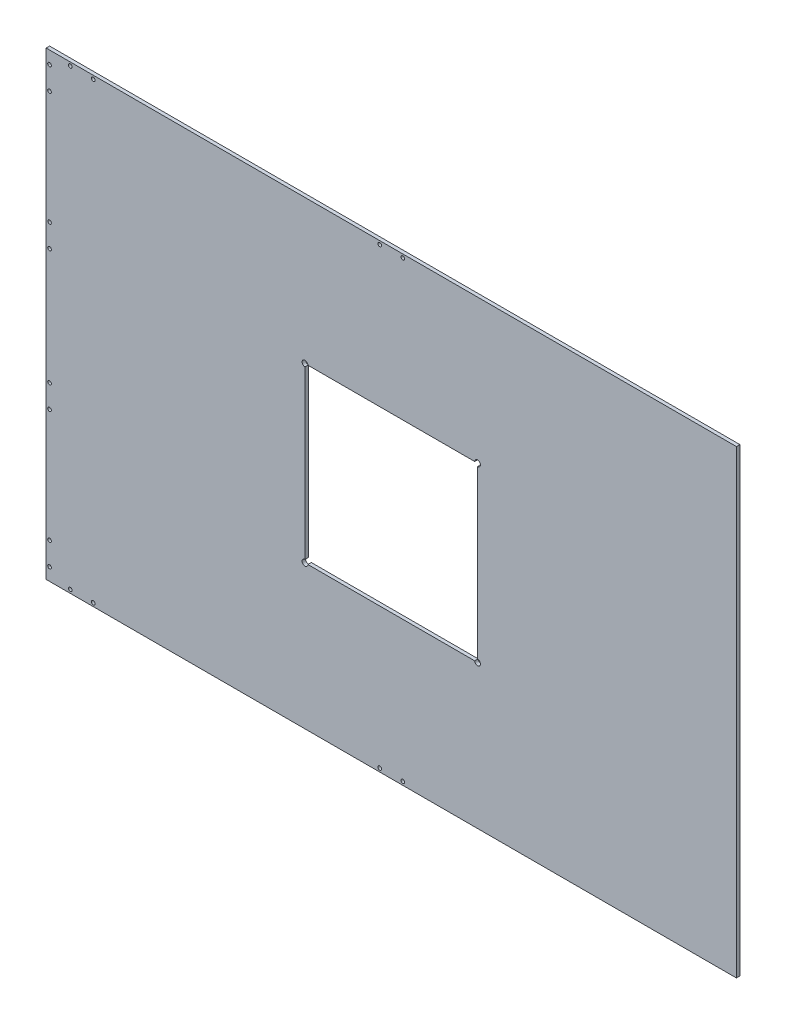
ISO-10303-21;
HEADER;
FILE_DESCRIPTION(('STEP AP214'),'2;1');
FILE_NAME('part.step','',(''),(''),'','','');
FILE_SCHEMA(('AUTOMOTIVE_DESIGN { 1 0 10303 214 1 1 1 1 }'));
ENDSEC;
DATA;
#1=APPLICATION_CONTEXT('core data for automotive mechanical design processes');
#2=APPLICATION_PROTOCOL_DEFINITION('international standard','automotive_design',2000,#1);
#3=PRODUCT_CONTEXT('',#1,'mechanical');
#4=PRODUCT('Part','Part','',(#3));
#5=PRODUCT_RELATED_PRODUCT_CATEGORY('part','',(#4));
#6=PRODUCT_DEFINITION_FORMATION('','',#4);
#7=PRODUCT_DEFINITION_CONTEXT('part definition',#1,'design');
#8=PRODUCT_DEFINITION('design','',#6,#7);
#9=PRODUCT_DEFINITION_SHAPE('','',#8);
#10=(LENGTH_UNIT() NAMED_UNIT(*) SI_UNIT(.MILLI.,.METRE.));
#11=(NAMED_UNIT(*) PLANE_ANGLE_UNIT() SI_UNIT($,.RADIAN.));
#12=(NAMED_UNIT(*) SI_UNIT($,.STERADIAN.) SOLID_ANGLE_UNIT());
#13=UNCERTAINTY_MEASURE_WITH_UNIT(LENGTH_MEASURE(1.E-05),#10,'distance_accuracy_value','');
#14=(GEOMETRIC_REPRESENTATION_CONTEXT(3) GLOBAL_UNCERTAINTY_ASSIGNED_CONTEXT((#13)) GLOBAL_UNIT_ASSIGNED_CONTEXT((#10,
#11,#12)) REPRESENTATION_CONTEXT('',''));
#15=CARTESIAN_POINT('',(0.,0.,0.));
#16=DIRECTION('',(0.,0.,1.));
#17=DIRECTION('',(1.,0.,0.));
#18=AXIS2_PLACEMENT_3D('',#15,#16,#17);
#19=CARTESIAN_POINT('',(0.,0.,3.));
#20=DIRECTION('',(0.,0.,1.));
#21=DIRECTION('',(1.,0.,0.));
#22=AXIS2_PLACEMENT_3D('',#19,#20,#21);
#23=PLANE('',#22);
#24=CARTESIAN_POINT('',(-297.,70.4999999999999,3.));
#25=DIRECTION('',(0.,0.,-1.));
#26=DIRECTION('',(1.,0.,0.));
#27=AXIS2_PLACEMENT_3D('',#24,#25,#26);
#28=CIRCLE('',#27,1.575);
#29=CARTESIAN_POINT('',(-295.425,70.4999999999999,3.));
#30=VERTEX_POINT('',#29);
#31=EDGE_CURVE('E288',#30,#30,#28,.T.);
#32=ORIENTED_EDGE('',*,*,#31,.T.);
#33=EDGE_LOOP('',(#32));
#34=FACE_BOUND('',#33,.T.);
#35=CARTESIAN_POINT('',(-297.,-50.4999999999999,3.));
#36=DIRECTION('',(0.,0.,-1.));
#37=DIRECTION('',(-1.,0.,0.));
#38=AXIS2_PLACEMENT_3D('',#35,#36,#37);
#39=CIRCLE('',#38,1.57500000000001);
#40=CARTESIAN_POINT('',(-298.575,-50.4999999999999,3.));
#41=VERTEX_POINT('',#40);
#42=EDGE_CURVE('E612',#41,#41,#39,.T.);
#43=ORIENTED_EDGE('',*,*,#42,.T.);
#44=EDGE_LOOP('',(#43));
#45=FACE_BOUND('',#44,.T.);
#46=CARTESIAN_POINT('',(-297.,-70.4999999999999,3.));
#47=DIRECTION('',(0.,0.,-1.));
#48=DIRECTION('',(-1.,0.,0.));
#49=AXIS2_PLACEMENT_3D('',#46,#47,#48);
#50=CIRCLE('',#49,1.575);
#51=CARTESIAN_POINT('',(-298.575,-70.4999999999999,3.));
#52=VERTEX_POINT('',#51);
#53=EDGE_CURVE('E625',#52,#52,#50,.T.);
#54=ORIENTED_EDGE('',*,*,#53,.T.);
#55=EDGE_LOOP('',(#54));
#56=FACE_BOUND('',#55,.T.);
#57=CARTESIAN_POINT('',(-297.,50.4999999999999,3.));
#58=DIRECTION('',(0.,0.,-1.));
#59=DIRECTION('',(1.,0.,0.));
#60=AXIS2_PLACEMENT_3D('',#57,#58,#59);
#61=CIRCLE('',#60,1.57500000000001);
#62=CARTESIAN_POINT('',(-295.425,50.4999999999999,3.));
#63=VERTEX_POINT('',#62);
#64=EDGE_CURVE('E628',#63,#63,#61,.T.);
#65=ORIENTED_EDGE('',*,*,#64,.T.);
#66=EDGE_LOOP('',(#65));
#67=FACE_BOUND('',#66,.T.);
#68=CARTESIAN_POINT('',(-297.,189.,3.));
#69=DIRECTION('',(0.,0.,1.));
#70=DIRECTION('',(1.,0.,0.));
#71=AXIS2_PLACEMENT_3D('',#68,#69,#70);
#72=CIRCLE('',#71,1.60000000000002);
#73=CARTESIAN_POINT('',(-295.4,189.,3.));
#74=VERTEX_POINT('',#73);
#75=EDGE_CURVE('E191',#74,#74,#72,.T.);
#76=ORIENTED_EDGE('',*,*,#75,.F.);
#77=EDGE_LOOP('',(#76));
#78=FACE_BOUND('',#77,.T.);
#79=CARTESIAN_POINT('',(-279.,197.,3.));
#80=DIRECTION('',(0.,0.,1.));
#81=DIRECTION('',(1.,0.,0.));
#82=AXIS2_PLACEMENT_3D('',#79,#80,#81);
#83=CIRCLE('',#82,1.60000000000002);
#84=CARTESIAN_POINT('',(-277.4,197.,3.));
#85=VERTEX_POINT('',#84);
#86=EDGE_CURVE('E203',#85,#85,#83,.T.);
#87=ORIENTED_EDGE('',*,*,#86,.F.);
#88=EDGE_LOOP('',(#87));
#89=FACE_BOUND('',#88,.T.);
#90=CARTESIAN_POINT('',(-259.,197.,3.));
#91=DIRECTION('',(0.,0.,1.));
#92=DIRECTION('',(1.,0.,0.));
#93=AXIS2_PLACEMENT_3D('',#90,#91,#92);
#94=CIRCLE('',#93,1.60000000000002);
#95=CARTESIAN_POINT('',(-257.4,197.,3.));
#96=VERTEX_POINT('',#95);
#97=EDGE_CURVE('E210',#96,#96,#94,.T.);
#98=ORIENTED_EDGE('',*,*,#97,.F.);
#99=EDGE_LOOP('',(#98));
#100=FACE_BOUND('',#99,.T.);
#101=CARTESIAN_POINT('',(-259.,-197.,3.));
#102=DIRECTION('',(0.,0.,1.));
#103=DIRECTION('',(-1.,0.,0.));
#104=AXIS2_PLACEMENT_3D('',#101,#102,#103);
#105=CIRCLE('',#104,1.60000000000002);
#106=CARTESIAN_POINT('',(-260.6,-197.,3.));
#107=VERTEX_POINT('',#106);
#108=EDGE_CURVE('E214',#107,#107,#105,.T.);
#109=ORIENTED_EDGE('',*,*,#108,.F.);
#110=EDGE_LOOP('',(#109));
#111=FACE_BOUND('',#110,.T.);
#112=CARTESIAN_POINT('',(-279.,-197.,3.));
#113=DIRECTION('',(0.,0.,1.));
#114=DIRECTION('',(-1.,0.,0.));
#115=AXIS2_PLACEMENT_3D('',#112,#113,#114);
#116=CIRCLE('',#115,1.60000000000002);
#117=CARTESIAN_POINT('',(-280.6,-197.,3.));
#118=VERTEX_POINT('',#117);
#119=EDGE_CURVE('E176',#118,#118,#116,.T.);
#120=ORIENTED_EDGE('',*,*,#119,.F.);
#121=EDGE_LOOP('',(#120));
#122=FACE_BOUND('',#121,.T.);
#123=CARTESIAN_POINT('',(-297.,-189.,3.));
#124=DIRECTION('',(0.,0.,1.));
#125=DIRECTION('',(-1.,0.,0.));
#126=AXIS2_PLACEMENT_3D('',#123,#124,#125);
#127=CIRCLE('',#126,1.60000000000002);
#128=CARTESIAN_POINT('',(-298.6,-189.,3.));
#129=VERTEX_POINT('',#128);
#130=EDGE_CURVE('E182',#129,#129,#127,.T.);
#131=ORIENTED_EDGE('',*,*,#130,.F.);
#132=EDGE_LOOP('',(#131));
#133=FACE_BOUND('',#132,.T.);
#134=CARTESIAN_POINT('',(-297.,-169.,3.));
#135=DIRECTION('',(0.,0.,1.));
#136=DIRECTION('',(-1.,0.,0.));
#137=AXIS2_PLACEMENT_3D('',#134,#135,#136);
#138=CIRCLE('',#137,1.60000000000002);
#139=CARTESIAN_POINT('',(-298.6,-169.,3.));
#140=VERTEX_POINT('',#139);
#141=EDGE_CURVE('E186',#140,#140,#138,.T.);
#142=ORIENTED_EDGE('',*,*,#141,.F.);
#143=EDGE_LOOP('',(#142));
#144=FACE_BOUND('',#143,.T.);
#145=CARTESIAN_POINT('',(-297.,169.,3.));
#146=DIRECTION('',(0.,0.,1.));
#147=DIRECTION('',(1.,0.,0.));
#148=AXIS2_PLACEMENT_3D('',#145,#146,#147);
#149=CIRCLE('',#148,1.60000000000002);
#150=CARTESIAN_POINT('',(-295.4,169.,3.));
#151=VERTEX_POINT('',#150);
#152=EDGE_CURVE('E199',#151,#151,#149,.T.);
#153=ORIENTED_EDGE('',*,*,#152,.F.);
#154=EDGE_LOOP('',(#153));
#155=FACE_BOUND('',#154,.T.);
#156=CARTESIAN_POINT('',(-10.0000000000001,197.,3.));
#157=DIRECTION('',(0.,0.,1.));
#158=DIRECTION('',(-1.,0.,0.));
#159=AXIS2_PLACEMENT_3D('',#156,#157,#158);
#160=CIRCLE('',#159,1.59999999999999);
#161=CARTESIAN_POINT('',(-11.6000000000001,197.,3.));
#162=VERTEX_POINT('',#161);
#163=EDGE_CURVE('E240',#162,#162,#160,.T.);
#164=ORIENTED_EDGE('',*,*,#163,.F.);
#165=EDGE_LOOP('',(#164));
#166=FACE_BOUND('',#165,.T.);
#167=CARTESIAN_POINT('',(9.99999999999989,-197.,3.));
#168=DIRECTION('',(0.,0.,1.));
#169=DIRECTION('',(1.,0.,0.));
#170=AXIS2_PLACEMENT_3D('',#167,#168,#169);
#171=CIRCLE('',#170,1.59999999999999);
#172=CARTESIAN_POINT('',(11.5999999999999,-197.,3.));
#173=VERTEX_POINT('',#172);
#174=EDGE_CURVE('E233',#173,#173,#171,.T.);
#175=ORIENTED_EDGE('',*,*,#174,.F.);
#176=EDGE_LOOP('',(#175));
#177=FACE_BOUND('',#176,.T.);
#178=CARTESIAN_POINT('',(-10.0000000000001,-197.,3.));
#179=DIRECTION('',(0.,0.,1.));
#180=DIRECTION('',(1.,0.,0.));
#181=AXIS2_PLACEMENT_3D('',#178,#179,#180);
#182=CIRCLE('',#181,1.59999999999999);
#183=CARTESIAN_POINT('',(-8.40000000000012,-197.,3.));
#184=VERTEX_POINT('',#183);
#185=EDGE_CURVE('E222',#184,#184,#182,.T.);
#186=ORIENTED_EDGE('',*,*,#185,.F.);
#187=EDGE_LOOP('',(#186));
#188=FACE_BOUND('',#187,.T.);
#189=CARTESIAN_POINT('',(9.99999999999989,197.,3.));
#190=DIRECTION('',(0.,0.,1.));
#191=DIRECTION('',(-1.,0.,0.));
#192=AXIS2_PLACEMENT_3D('',#189,#190,#191);
#193=CIRCLE('',#192,1.59999999999999);
#194=CARTESIAN_POINT('',(8.39999999999989,197.,3.));
#195=VERTEX_POINT('',#194);
#196=EDGE_CURVE('E227',#195,#195,#193,.T.);
#197=ORIENTED_EDGE('',*,*,#196,.F.);
#198=EDGE_LOOP('',(#197));
#199=FACE_BOUND('',#198,.T.);
#200=DIRECTION('',(0.,1.,0.));
#201=VECTOR('',#200,1.);
#202=CARTESIAN_POINT('',(300.,200.,3.));
#203=LINE('',#202,#201);
#204=CARTESIAN_POINT('',(300.,-200.,3.));
#205=VERTEX_POINT('',#204);
#206=CARTESIAN_POINT('',(300.,200.,3.));
#207=VERTEX_POINT('',#206);
#208=EDGE_CURVE('E247',#205,#207,#203,.T.);
#209=ORIENTED_EDGE('',*,*,#208,.T.);
#210=DIRECTION('',(-1.,0.,0.));
#211=VECTOR('',#210,1.);
#212=CARTESIAN_POINT('',(-300.,200.,3.));
#213=LINE('',#212,#211);
#214=CARTESIAN_POINT('',(-300.,200.,3.));
#215=VERTEX_POINT('',#214);
#216=EDGE_CURVE('E252',#207,#215,#213,.T.);
#217=ORIENTED_EDGE('',*,*,#216,.T.);
#218=DIRECTION('',(0.,-1.,0.));
#219=VECTOR('',#218,1.);
#220=CARTESIAN_POINT('',(-300.,200.,3.));
#221=LINE('',#220,#219);
#222=CARTESIAN_POINT('',(-300.,-200.,3.));
#223=VERTEX_POINT('',#222);
#224=EDGE_CURVE('E251',#215,#223,#221,.T.);
#225=ORIENTED_EDGE('',*,*,#224,.T.);
#226=DIRECTION('',(1.,0.,0.));
#227=VECTOR('',#226,1.);
#228=CARTESIAN_POINT('',(-300.,-200.,3.));
#229=LINE('',#228,#227);
#230=EDGE_CURVE('E257',#223,#205,#229,.T.);
#231=ORIENTED_EDGE('',*,*,#230,.T.);
#232=EDGE_LOOP('',(#209,#217,#225,#231));
#233=FACE_BOUND('',#232,.T.);
#234=DIRECTION('',(1.,0.,0.));
#235=VECTOR('',#234,1.);
#236=CARTESIAN_POINT('',(75.,75.,3.));
#237=LINE('',#236,#235);
#238=CARTESIAN_POINT('',(-72.5,75.,3.));
#239=VERTEX_POINT('',#238);
#240=CARTESIAN_POINT('',(72.5,75.,3.));
#241=VERTEX_POINT('',#240);
#242=EDGE_CURVE('E147',#239,#241,#237,.T.);
#243=ORIENTED_EDGE('',*,*,#242,.T.);
#244=CARTESIAN_POINT('',(75.,75.,3.));
#245=DIRECTION('',(0.,0.,-1.));
#246=DIRECTION('',(-1.,0.,0.));
#247=AXIS2_PLACEMENT_3D('',#244,#245,#246);
#248=CIRCLE('',#247,2.5);
#249=CARTESIAN_POINT('',(75.,72.5,3.));
#250=VERTEX_POINT('',#249);
#251=EDGE_CURVE('E285',#241,#250,#248,.T.);
#252=ORIENTED_EDGE('',*,*,#251,.T.);
#253=DIRECTION('',(0.,-1.,0.));
#254=VECTOR('',#253,1.);
#255=CARTESIAN_POINT('',(75.,75.,3.));
#256=LINE('',#255,#254);
#257=CARTESIAN_POINT('',(75.,-72.5,3.));
#258=VERTEX_POINT('',#257);
#259=EDGE_CURVE('E155',#250,#258,#256,.T.);
#260=ORIENTED_EDGE('',*,*,#259,.T.);
#261=CARTESIAN_POINT('',(75.,-75.,3.));
#262=DIRECTION('',(0.,0.,-1.));
#263=DIRECTION('',(-1.,0.,0.));
#264=AXIS2_PLACEMENT_3D('',#261,#262,#263);
#265=CIRCLE('',#264,2.50000000000001);
#266=CARTESIAN_POINT('',(72.5,-75.,3.));
#267=VERTEX_POINT('',#266);
#268=EDGE_CURVE('E64',#258,#267,#265,.T.);
#269=ORIENTED_EDGE('',*,*,#268,.T.);
#270=DIRECTION('',(-1.,0.,0.));
#271=VECTOR('',#270,1.);
#272=CARTESIAN_POINT('',(75.,-75.,3.));
#273=LINE('',#272,#271);
#274=CARTESIAN_POINT('',(-72.5,-75.,3.));
#275=VERTEX_POINT('',#274);
#276=EDGE_CURVE('E158',#267,#275,#273,.T.);
#277=ORIENTED_EDGE('',*,*,#276,.T.);
#278=CARTESIAN_POINT('',(-75.,-75.,3.));
#279=DIRECTION('',(0.,0.,-1.));
#280=DIRECTION('',(-1.,0.,0.));
#281=AXIS2_PLACEMENT_3D('',#278,#279,#280);
#282=CIRCLE('',#281,2.5);
#283=CARTESIAN_POINT('',(-75.,-72.5,3.));
#284=VERTEX_POINT('',#283);
#285=EDGE_CURVE('E57',#275,#284,#282,.T.);
#286=ORIENTED_EDGE('',*,*,#285,.T.);
#287=DIRECTION('',(0.,1.,0.));
#288=VECTOR('',#287,1.);
#289=CARTESIAN_POINT('',(-75.,75.,3.));
#290=LINE('',#289,#288);
#291=CARTESIAN_POINT('',(-75.,72.5,3.));
#292=VERTEX_POINT('',#291);
#293=EDGE_CURVE('E149',#284,#292,#290,.T.);
#294=ORIENTED_EDGE('',*,*,#293,.T.);
#295=CARTESIAN_POINT('',(-75.,75.,3.));
#296=DIRECTION('',(0.,0.,-1.));
#297=DIRECTION('',(-1.,0.,0.));
#298=AXIS2_PLACEMENT_3D('',#295,#296,#297);
#299=CIRCLE('',#298,2.5);
#300=EDGE_CURVE('E132',#292,#239,#299,.T.);
#301=ORIENTED_EDGE('',*,*,#300,.T.);
#302=EDGE_LOOP('',(#243,#252,#260,#269,#277,#286,#294,#301));
#303=FACE_BOUND('',#302,.T.);
#304=ADVANCED_FACE('F41',(#34,#45,#56,#67,#78,#89,#100,#111,#122,#133,#144,#155,#166,#177,#188,
#199,#233,#303),#23,.T.);
#305=CARTESIAN_POINT('',(0.,0.,0.));
#306=DIRECTION('',(0.,0.,1.));
#307=DIRECTION('',(1.,0.,0.));
#308=AXIS2_PLACEMENT_3D('',#305,#306,#307);
#309=PLANE('',#308);
#310=CARTESIAN_POINT('',(-297.,70.4999999999999,0.));
#311=DIRECTION('',(0.,0.,-1.));
#312=DIRECTION('',(1.,0.,0.));
#313=AXIS2_PLACEMENT_3D('',#310,#311,#312);
#314=CIRCLE('',#313,1.575);
#315=CARTESIAN_POINT('',(-295.425,70.4999999999999,0.));
#316=VERTEX_POINT('',#315);
#317=EDGE_CURVE('E289',#316,#316,#314,.T.);
#318=ORIENTED_EDGE('',*,*,#317,.F.);
#319=EDGE_LOOP('',(#318));
#320=FACE_BOUND('',#319,.T.);
#321=CARTESIAN_POINT('',(-297.,-50.4999999999999,0.));
#322=DIRECTION('',(0.,0.,-1.));
#323=DIRECTION('',(-1.,0.,0.));
#324=AXIS2_PLACEMENT_3D('',#321,#322,#323);
#325=CIRCLE('',#324,1.57500000000001);
#326=CARTESIAN_POINT('',(-298.575,-50.4999999999999,0.));
#327=VERTEX_POINT('',#326);
#328=EDGE_CURVE('E613',#327,#327,#325,.T.);
#329=ORIENTED_EDGE('',*,*,#328,.F.);
#330=EDGE_LOOP('',(#329));
#331=FACE_BOUND('',#330,.T.);
#332=CARTESIAN_POINT('',(-297.,-70.4999999999999,0.));
#333=DIRECTION('',(0.,0.,-1.));
#334=DIRECTION('',(-1.,0.,0.));
#335=AXIS2_PLACEMENT_3D('',#332,#333,#334);
#336=CIRCLE('',#335,1.575);
#337=CARTESIAN_POINT('',(-298.575,-70.4999999999999,0.));
#338=VERTEX_POINT('',#337);
#339=EDGE_CURVE('E620',#338,#338,#336,.T.);
#340=ORIENTED_EDGE('',*,*,#339,.F.);
#341=EDGE_LOOP('',(#340));
#342=FACE_BOUND('',#341,.T.);
#343=CARTESIAN_POINT('',(-297.,50.4999999999999,0.));
#344=DIRECTION('',(0.,0.,-1.));
#345=DIRECTION('',(1.,0.,0.));
#346=AXIS2_PLACEMENT_3D('',#343,#344,#345);
#347=CIRCLE('',#346,1.57500000000001);
#348=CARTESIAN_POINT('',(-295.425,50.4999999999999,0.));
#349=VERTEX_POINT('',#348);
#350=EDGE_CURVE('E622',#349,#349,#347,.T.);
#351=ORIENTED_EDGE('',*,*,#350,.F.);
#352=EDGE_LOOP('',(#351));
#353=FACE_BOUND('',#352,.T.);
#354=CARTESIAN_POINT('',(-297.,189.,0.));
#355=DIRECTION('',(0.,0.,1.));
#356=DIRECTION('',(1.,0.,0.));
#357=AXIS2_PLACEMENT_3D('',#354,#355,#356);
#358=CIRCLE('',#357,1.60000000000002);
#359=CARTESIAN_POINT('',(-295.4,189.,0.));
#360=VERTEX_POINT('',#359);
#361=EDGE_CURVE('E200',#360,#360,#358,.T.);
#362=ORIENTED_EDGE('',*,*,#361,.T.);
#363=EDGE_LOOP('',(#362));
#364=FACE_BOUND('',#363,.T.);
#365=CARTESIAN_POINT('',(-279.,197.,0.));
#366=DIRECTION('',(0.,0.,1.));
#367=DIRECTION('',(1.,0.,0.));
#368=AXIS2_PLACEMENT_3D('',#365,#366,#367);
#369=CIRCLE('',#368,1.60000000000002);
#370=CARTESIAN_POINT('',(-277.4,197.,0.));
#371=VERTEX_POINT('',#370);
#372=EDGE_CURVE('E202',#371,#371,#369,.T.);
#373=ORIENTED_EDGE('',*,*,#372,.T.);
#374=EDGE_LOOP('',(#373));
#375=FACE_BOUND('',#374,.T.);
#376=CARTESIAN_POINT('',(-259.,197.,0.));
#377=DIRECTION('',(0.,0.,1.));
#378=DIRECTION('',(1.,0.,0.));
#379=AXIS2_PLACEMENT_3D('',#376,#377,#378);
#380=CIRCLE('',#379,1.60000000000002);
#381=CARTESIAN_POINT('',(-257.4,197.,0.));
#382=VERTEX_POINT('',#381);
#383=EDGE_CURVE('E208',#382,#382,#380,.T.);
#384=ORIENTED_EDGE('',*,*,#383,.T.);
#385=EDGE_LOOP('',(#384));
#386=FACE_BOUND('',#385,.T.);
#387=CARTESIAN_POINT('',(-259.,-197.,0.));
#388=DIRECTION('',(0.,0.,1.));
#389=DIRECTION('',(-1.,0.,0.));
#390=AXIS2_PLACEMENT_3D('',#387,#388,#389);
#391=CIRCLE('',#390,1.60000000000002);
#392=CARTESIAN_POINT('',(-260.6,-197.,0.));
#393=VERTEX_POINT('',#392);
#394=EDGE_CURVE('E177',#393,#393,#391,.T.);
#395=ORIENTED_EDGE('',*,*,#394,.T.);
#396=EDGE_LOOP('',(#395));
#397=FACE_BOUND('',#396,.T.);
#398=CARTESIAN_POINT('',(-279.,-197.,0.));
#399=DIRECTION('',(0.,0.,1.));
#400=DIRECTION('',(-1.,0.,0.));
#401=AXIS2_PLACEMENT_3D('',#398,#399,#400);
#402=CIRCLE('',#401,1.60000000000002);
#403=CARTESIAN_POINT('',(-280.6,-197.,0.));
#404=VERTEX_POINT('',#403);
#405=EDGE_CURVE('E179',#404,#404,#402,.T.);
#406=ORIENTED_EDGE('',*,*,#405,.T.);
#407=EDGE_LOOP('',(#406));
#408=FACE_BOUND('',#407,.T.);
#409=CARTESIAN_POINT('',(-297.,-189.,0.));
#410=DIRECTION('',(0.,0.,1.));
#411=DIRECTION('',(-1.,0.,0.));
#412=AXIS2_PLACEMENT_3D('',#409,#410,#411);
#413=CIRCLE('',#412,1.60000000000002);
#414=CARTESIAN_POINT('',(-298.6,-189.,0.));
#415=VERTEX_POINT('',#414);
#416=EDGE_CURVE('E187',#415,#415,#413,.T.);
#417=ORIENTED_EDGE('',*,*,#416,.T.);
#418=EDGE_LOOP('',(#417));
#419=FACE_BOUND('',#418,.T.);
#420=CARTESIAN_POINT('',(-297.,-169.,0.));
#421=DIRECTION('',(0.,0.,1.));
#422=DIRECTION('',(-1.,0.,0.));
#423=AXIS2_PLACEMENT_3D('',#420,#421,#422);
#424=CIRCLE('',#423,1.60000000000002);
#425=CARTESIAN_POINT('',(-298.6,-169.,0.));
#426=VERTEX_POINT('',#425);
#427=EDGE_CURVE('E165',#426,#426,#424,.T.);
#428=ORIENTED_EDGE('',*,*,#427,.T.);
#429=EDGE_LOOP('',(#428));
#430=FACE_BOUND('',#429,.T.);
#431=CARTESIAN_POINT('',(-297.,169.,0.));
#432=DIRECTION('',(0.,0.,1.));
#433=DIRECTION('',(1.,0.,0.));
#434=AXIS2_PLACEMENT_3D('',#431,#432,#433);
#435=CIRCLE('',#434,1.60000000000002);
#436=CARTESIAN_POINT('',(-295.4,169.,0.));
#437=VERTEX_POINT('',#436);
#438=EDGE_CURVE('E220',#437,#437,#435,.T.);
#439=ORIENTED_EDGE('',*,*,#438,.T.);
#440=EDGE_LOOP('',(#439));
#441=FACE_BOUND('',#440,.T.);
#442=CARTESIAN_POINT('',(-10.0000000000001,197.,0.));
#443=DIRECTION('',(0.,0.,1.));
#444=DIRECTION('',(-1.,0.,0.));
#445=AXIS2_PLACEMENT_3D('',#442,#443,#444);
#446=CIRCLE('',#445,1.59999999999999);
#447=CARTESIAN_POINT('',(-11.6000000000001,197.,0.));
#448=VERTEX_POINT('',#447);
#449=EDGE_CURVE('E223',#448,#448,#446,.T.);
#450=ORIENTED_EDGE('',*,*,#449,.T.);
#451=EDGE_LOOP('',(#450));
#452=FACE_BOUND('',#451,.T.);
#453=CARTESIAN_POINT('',(9.99999999999989,-197.,0.));
#454=DIRECTION('',(0.,0.,1.));
#455=DIRECTION('',(1.,0.,0.));
#456=AXIS2_PLACEMENT_3D('',#453,#454,#455);
#457=CIRCLE('',#456,1.59999999999999);
#458=CARTESIAN_POINT('',(11.5999999999999,-197.,0.));
#459=VERTEX_POINT('',#458);
#460=EDGE_CURVE('E234',#459,#459,#457,.T.);
#461=ORIENTED_EDGE('',*,*,#460,.T.);
#462=EDGE_LOOP('',(#461));
#463=FACE_BOUND('',#462,.T.);
#464=CARTESIAN_POINT('',(-10.0000000000001,-197.,0.));
#465=DIRECTION('',(0.,0.,1.));
#466=DIRECTION('',(1.,0.,0.));
#467=AXIS2_PLACEMENT_3D('',#464,#465,#466);
#468=CIRCLE('',#467,1.59999999999999);
#469=CARTESIAN_POINT('',(-8.40000000000012,-197.,0.));
#470=VERTEX_POINT('',#469);
#471=EDGE_CURVE('E226',#470,#470,#468,.T.);
#472=ORIENTED_EDGE('',*,*,#471,.T.);
#473=EDGE_LOOP('',(#472));
#474=FACE_BOUND('',#473,.T.);
#475=CARTESIAN_POINT('',(9.99999999999989,197.,0.));
#476=DIRECTION('',(0.,0.,1.));
#477=DIRECTION('',(-1.,0.,0.));
#478=AXIS2_PLACEMENT_3D('',#475,#476,#477);
#479=CIRCLE('',#478,1.59999999999999);
#480=CARTESIAN_POINT('',(8.39999999999989,197.,0.));
#481=VERTEX_POINT('',#480);
#482=EDGE_CURVE('E245',#481,#481,#479,.T.);
#483=ORIENTED_EDGE('',*,*,#482,.T.);
#484=EDGE_LOOP('',(#483));
#485=FACE_BOUND('',#484,.T.);
#486=DIRECTION('',(0.,1.,0.));
#487=VECTOR('',#486,1.);
#488=CARTESIAN_POINT('',(300.,200.,0.));
#489=LINE('',#488,#487);
#490=CARTESIAN_POINT('',(300.,-200.,0.));
#491=VERTEX_POINT('',#490);
#492=CARTESIAN_POINT('',(300.,200.,0.));
#493=VERTEX_POINT('',#492);
#494=EDGE_CURVE('E244',#491,#493,#489,.T.);
#495=ORIENTED_EDGE('',*,*,#494,.F.);
#496=DIRECTION('',(1.,0.,0.));
#497=VECTOR('',#496,1.);
#498=CARTESIAN_POINT('',(-300.,-200.,0.));
#499=LINE('',#498,#497);
#500=CARTESIAN_POINT('',(-300.,-200.,0.));
#501=VERTEX_POINT('',#500);
#502=EDGE_CURVE('E255',#501,#491,#499,.T.);
#503=ORIENTED_EDGE('',*,*,#502,.F.);
#504=DIRECTION('',(0.,-1.,0.));
#505=VECTOR('',#504,1.);
#506=CARTESIAN_POINT('',(-300.,200.,0.));
#507=LINE('',#506,#505);
#508=CARTESIAN_POINT('',(-300.,200.,0.));
#509=VERTEX_POINT('',#508);
#510=EDGE_CURVE('E265',#509,#501,#507,.T.);
#511=ORIENTED_EDGE('',*,*,#510,.F.);
#512=DIRECTION('',(-1.,0.,0.));
#513=VECTOR('',#512,1.);
#514=CARTESIAN_POINT('',(-300.,200.,0.));
#515=LINE('',#514,#513);
#516=EDGE_CURVE('E262',#493,#509,#515,.T.);
#517=ORIENTED_EDGE('',*,*,#516,.F.);
#518=EDGE_LOOP('',(#495,#503,#511,#517));
#519=FACE_BOUND('',#518,.T.);
#520=CARTESIAN_POINT('',(75.,75.,0.));
#521=DIRECTION('',(0.,0.,-1.));
#522=DIRECTION('',(-1.,0.,0.));
#523=AXIS2_PLACEMENT_3D('',#520,#521,#522);
#524=CIRCLE('',#523,2.5);
#525=CARTESIAN_POINT('',(72.5,75.,0.));
#526=VERTEX_POINT('',#525);
#527=CARTESIAN_POINT('',(75.,72.5,0.));
#528=VERTEX_POINT('',#527);
#529=EDGE_CURVE('E283',#526,#528,#524,.T.);
#530=ORIENTED_EDGE('',*,*,#529,.F.);
#531=DIRECTION('',(1.,0.,0.));
#532=VECTOR('',#531,1.);
#533=CARTESIAN_POINT('',(75.,75.,0.));
#534=LINE('',#533,#532);
#535=CARTESIAN_POINT('',(-72.5,75.,0.));
#536=VERTEX_POINT('',#535);
#537=EDGE_CURVE('E166',#536,#526,#534,.T.);
#538=ORIENTED_EDGE('',*,*,#537,.F.);
#539=CARTESIAN_POINT('',(-75.,75.,0.));
#540=DIRECTION('',(0.,0.,-1.));
#541=DIRECTION('',(-1.,0.,0.));
#542=AXIS2_PLACEMENT_3D('',#539,#540,#541);
#543=CIRCLE('',#542,2.5);
#544=CARTESIAN_POINT('',(-75.,72.5,0.));
#545=VERTEX_POINT('',#544);
#546=EDGE_CURVE('E131',#545,#536,#543,.T.);
#547=ORIENTED_EDGE('',*,*,#546,.F.);
#548=DIRECTION('',(0.,1.,0.));
#549=VECTOR('',#548,1.);
#550=CARTESIAN_POINT('',(-75.,75.,0.));
#551=LINE('',#550,#549);
#552=CARTESIAN_POINT('',(-75.,-72.5,0.));
#553=VERTEX_POINT('',#552);
#554=EDGE_CURVE('E164',#553,#545,#551,.T.);
#555=ORIENTED_EDGE('',*,*,#554,.F.);
#556=CARTESIAN_POINT('',(-75.,-75.,0.));
#557=DIRECTION('',(0.,0.,-1.));
#558=DIRECTION('',(-1.,0.,0.));
#559=AXIS2_PLACEMENT_3D('',#556,#557,#558);
#560=CIRCLE('',#559,2.5);
#561=CARTESIAN_POINT('',(-72.5,-75.,0.));
#562=VERTEX_POINT('',#561);
#563=EDGE_CURVE('E294',#562,#553,#560,.T.);
#564=ORIENTED_EDGE('',*,*,#563,.F.);
#565=DIRECTION('',(-1.,0.,0.));
#566=VECTOR('',#565,1.);
#567=CARTESIAN_POINT('',(75.,-75.,0.));
#568=LINE('',#567,#566);
#569=CARTESIAN_POINT('',(72.5,-75.,0.));
#570=VERTEX_POINT('',#569);
#571=EDGE_CURVE('E156',#570,#562,#568,.T.);
#572=ORIENTED_EDGE('',*,*,#571,.F.);
#573=CARTESIAN_POINT('',(75.,-75.,0.));
#574=DIRECTION('',(0.,0.,-1.));
#575=DIRECTION('',(-1.,0.,0.));
#576=AXIS2_PLACEMENT_3D('',#573,#574,#575);
#577=CIRCLE('',#576,2.50000000000001);
#578=CARTESIAN_POINT('',(75.,-72.5,0.));
#579=VERTEX_POINT('',#578);
#580=EDGE_CURVE('E633',#579,#570,#577,.T.);
#581=ORIENTED_EDGE('',*,*,#580,.F.);
#582=DIRECTION('',(0.,-1.,0.));
#583=VECTOR('',#582,1.);
#584=CARTESIAN_POINT('',(75.,75.,0.));
#585=LINE('',#584,#583);
#586=EDGE_CURVE('E171',#528,#579,#585,.T.);
#587=ORIENTED_EDGE('',*,*,#586,.F.);
#588=EDGE_LOOP('',(#530,#538,#547,#555,#564,#572,#581,#587));
#589=FACE_BOUND('',#588,.T.);
#590=ADVANCED_FACE('F308',(#320,#331,#342,#353,#364,#375,#386,#397,#408,#419,#430,#441,#452,
#463,#474,#485,#519,#589),#309,.F.);
#591=CARTESIAN_POINT('',(300.,200.,3.));
#592=DIRECTION('',(-1.,0.,0.));
#593=DIRECTION('',(0.,0.,1.));
#594=AXIS2_PLACEMENT_3D('',#591,#592,#593);
#595=PLANE('',#594);
#596=ORIENTED_EDGE('',*,*,#494,.T.);
#597=DIRECTION('',(0.,0.,-1.));
#598=VECTOR('',#597,1.);
#599=CARTESIAN_POINT('',(300.,200.,3.));
#600=LINE('',#599,#598);
#601=EDGE_CURVE('E139',#207,#493,#600,.T.);
#602=ORIENTED_EDGE('',*,*,#601,.F.);
#603=ORIENTED_EDGE('',*,*,#208,.F.);
#604=DIRECTION('',(0.,0.,-1.));
#605=VECTOR('',#604,1.);
#606=CARTESIAN_POINT('',(300.,-200.,3.));
#607=LINE('',#606,#605);
#608=EDGE_CURVE('E259',#205,#491,#607,.T.);
#609=ORIENTED_EDGE('',*,*,#608,.T.);
#610=EDGE_LOOP('',(#596,#602,#603,#609));
#611=FACE_BOUND('',#610,.T.);
#612=ADVANCED_FACE('F43',(#611),#595,.F.);
#613=CARTESIAN_POINT('',(-300.,200.,3.));
#614=DIRECTION('',(0.,-1.,0.));
#615=DIRECTION('',(0.,0.,-1.));
#616=AXIS2_PLACEMENT_3D('',#613,#614,#615);
#617=PLANE('',#616);
#618=ORIENTED_EDGE('',*,*,#516,.T.);
#619=DIRECTION('',(0.,0.,-1.));
#620=VECTOR('',#619,1.);
#621=CARTESIAN_POINT('',(-300.,200.,3.));
#622=LINE('',#621,#620);
#623=EDGE_CURVE('E272',#215,#509,#622,.T.);
#624=ORIENTED_EDGE('',*,*,#623,.F.);
#625=ORIENTED_EDGE('',*,*,#216,.F.);
#626=ORIENTED_EDGE('',*,*,#601,.T.);
#627=EDGE_LOOP('',(#618,#624,#625,#626));
#628=FACE_BOUND('',#627,.T.);
#629=ADVANCED_FACE('F342',(#628),#617,.F.);
#630=CARTESIAN_POINT('',(-300.,200.,3.));
#631=DIRECTION('',(1.,0.,0.));
#632=DIRECTION('',(0.,1.,0.));
#633=AXIS2_PLACEMENT_3D('',#630,#631,#632);
#634=PLANE('',#633);
#635=ORIENTED_EDGE('',*,*,#510,.T.);
#636=DIRECTION('',(0.,0.,-1.));
#637=VECTOR('',#636,1.);
#638=CARTESIAN_POINT('',(-300.,-200.,3.));
#639=LINE('',#638,#637);
#640=EDGE_CURVE('E266',#223,#501,#639,.T.);
#641=ORIENTED_EDGE('',*,*,#640,.F.);
#642=ORIENTED_EDGE('',*,*,#224,.F.);
#643=ORIENTED_EDGE('',*,*,#623,.T.);
#644=EDGE_LOOP('',(#635,#641,#642,#643));
#645=FACE_BOUND('',#644,.T.);
#646=ADVANCED_FACE('F336',(#645),#634,.F.);
#647=CARTESIAN_POINT('',(-300.,-200.,3.));
#648=DIRECTION('',(0.,1.,0.));
#649=DIRECTION('',(0.,0.,1.));
#650=AXIS2_PLACEMENT_3D('',#647,#648,#649);
#651=PLANE('',#650);
#652=ORIENTED_EDGE('',*,*,#502,.T.);
#653=ORIENTED_EDGE('',*,*,#608,.F.);
#654=ORIENTED_EDGE('',*,*,#230,.F.);
#655=ORIENTED_EDGE('',*,*,#640,.T.);
#656=EDGE_LOOP('',(#652,#653,#654,#655));
#657=FACE_BOUND('',#656,.T.);
#658=ADVANCED_FACE('F334',(#657),#651,.F.);
#659=CARTESIAN_POINT('',(9.99999999999989,197.,0.));
#660=DIRECTION('',(0.,0.,1.));
#661=DIRECTION('',(1.,0.,0.));
#662=AXIS2_PLACEMENT_3D('',#659,#660,#661);
#663=CYLINDRICAL_SURFACE('',#662,1.59999999999999);
#664=ORIENTED_EDGE('',*,*,#482,.F.);
#665=EDGE_LOOP('',(#664));
#666=FACE_BOUND('',#665,.T.);
#667=ORIENTED_EDGE('',*,*,#196,.T.);
#668=EDGE_LOOP('',(#667));
#669=FACE_BOUND('',#668,.T.);
#670=ADVANCED_FACE('F335',(#666,#669),#663,.F.);
#671=CARTESIAN_POINT('',(-10.0000000000001,-197.,0.));
#672=DIRECTION('',(0.,0.,1.));
#673=DIRECTION('',(1.,0.,0.));
#674=AXIS2_PLACEMENT_3D('',#671,#672,#673);
#675=CYLINDRICAL_SURFACE('',#674,1.59999999999999);
#676=ORIENTED_EDGE('',*,*,#471,.F.);
#677=EDGE_LOOP('',(#676));
#678=FACE_BOUND('',#677,.T.);
#679=ORIENTED_EDGE('',*,*,#185,.T.);
#680=EDGE_LOOP('',(#679));
#681=FACE_BOUND('',#680,.T.);
#682=ADVANCED_FACE('F386',(#678,#681),#675,.F.);
#683=CARTESIAN_POINT('',(9.99999999999989,-197.,0.));
#684=DIRECTION('',(0.,0.,1.));
#685=DIRECTION('',(1.,0.,0.));
#686=AXIS2_PLACEMENT_3D('',#683,#684,#685);
#687=CYLINDRICAL_SURFACE('',#686,1.59999999999999);
#688=ORIENTED_EDGE('',*,*,#460,.F.);
#689=EDGE_LOOP('',(#688));
#690=FACE_BOUND('',#689,.T.);
#691=ORIENTED_EDGE('',*,*,#174,.T.);
#692=EDGE_LOOP('',(#691));
#693=FACE_BOUND('',#692,.T.);
#694=ADVANCED_FACE('F396',(#690,#693),#687,.F.);
#695=CARTESIAN_POINT('',(-10.0000000000001,197.,0.));
#696=DIRECTION('',(0.,0.,1.));
#697=DIRECTION('',(1.,0.,0.));
#698=AXIS2_PLACEMENT_3D('',#695,#696,#697);
#699=CYLINDRICAL_SURFACE('',#698,1.59999999999999);
#700=ORIENTED_EDGE('',*,*,#449,.F.);
#701=EDGE_LOOP('',(#700));
#702=FACE_BOUND('',#701,.T.);
#703=ORIENTED_EDGE('',*,*,#163,.T.);
#704=EDGE_LOOP('',(#703));
#705=FACE_BOUND('',#704,.T.);
#706=ADVANCED_FACE('F409',(#702,#705),#699,.F.);
#707=CARTESIAN_POINT('',(-297.,169.,0.));
#708=DIRECTION('',(0.,0.,1.));
#709=DIRECTION('',(1.,0.,0.));
#710=AXIS2_PLACEMENT_3D('',#707,#708,#709);
#711=CYLINDRICAL_SURFACE('',#710,1.60000000000002);
#712=ORIENTED_EDGE('',*,*,#438,.F.);
#713=EDGE_LOOP('',(#712));
#714=FACE_BOUND('',#713,.T.);
#715=ORIENTED_EDGE('',*,*,#152,.T.);
#716=EDGE_LOOP('',(#715));
#717=FACE_BOUND('',#716,.T.);
#718=ADVANCED_FACE('F416',(#714,#717),#711,.F.);
#719=CARTESIAN_POINT('',(-297.,-169.,0.));
#720=DIRECTION('',(0.,0.,1.));
#721=DIRECTION('',(1.,0.,0.));
#722=AXIS2_PLACEMENT_3D('',#719,#720,#721);
#723=CYLINDRICAL_SURFACE('',#722,1.60000000000002);
#724=ORIENTED_EDGE('',*,*,#427,.F.);
#725=EDGE_LOOP('',(#724));
#726=FACE_BOUND('',#725,.T.);
#727=ORIENTED_EDGE('',*,*,#141,.T.);
#728=EDGE_LOOP('',(#727));
#729=FACE_BOUND('',#728,.T.);
#730=ADVANCED_FACE('F430',(#726,#729),#723,.F.);
#731=CARTESIAN_POINT('',(-297.,-189.,0.));
#732=DIRECTION('',(0.,0.,1.));
#733=DIRECTION('',(1.,0.,0.));
#734=AXIS2_PLACEMENT_3D('',#731,#732,#733);
#735=CYLINDRICAL_SURFACE('',#734,1.60000000000002);
#736=ORIENTED_EDGE('',*,*,#416,.F.);
#737=EDGE_LOOP('',(#736));
#738=FACE_BOUND('',#737,.T.);
#739=ORIENTED_EDGE('',*,*,#130,.T.);
#740=EDGE_LOOP('',(#739));
#741=FACE_BOUND('',#740,.T.);
#742=ADVANCED_FACE('F440',(#738,#741),#735,.F.);
#743=CARTESIAN_POINT('',(-279.,-197.,0.));
#744=DIRECTION('',(0.,0.,1.));
#745=DIRECTION('',(1.,0.,0.));
#746=AXIS2_PLACEMENT_3D('',#743,#744,#745);
#747=CYLINDRICAL_SURFACE('',#746,1.60000000000002);
#748=ORIENTED_EDGE('',*,*,#405,.F.);
#749=EDGE_LOOP('',(#748));
#750=FACE_BOUND('',#749,.T.);
#751=ORIENTED_EDGE('',*,*,#119,.T.);
#752=EDGE_LOOP('',(#751));
#753=FACE_BOUND('',#752,.T.);
#754=ADVANCED_FACE('F450',(#750,#753),#747,.F.);
#755=CARTESIAN_POINT('',(-259.,-197.,0.));
#756=DIRECTION('',(0.,0.,1.));
#757=DIRECTION('',(1.,0.,0.));
#758=AXIS2_PLACEMENT_3D('',#755,#756,#757);
#759=CYLINDRICAL_SURFACE('',#758,1.60000000000002);
#760=ORIENTED_EDGE('',*,*,#394,.F.);
#761=EDGE_LOOP('',(#760));
#762=FACE_BOUND('',#761,.T.);
#763=ORIENTED_EDGE('',*,*,#108,.T.);
#764=EDGE_LOOP('',(#763));
#765=FACE_BOUND('',#764,.T.);
#766=ADVANCED_FACE('F459',(#762,#765),#759,.F.);
#767=CARTESIAN_POINT('',(-259.,197.,0.));
#768=DIRECTION('',(0.,0.,1.));
#769=DIRECTION('',(1.,0.,0.));
#770=AXIS2_PLACEMENT_3D('',#767,#768,#769);
#771=CYLINDRICAL_SURFACE('',#770,1.60000000000002);
#772=ORIENTED_EDGE('',*,*,#383,.F.);
#773=EDGE_LOOP('',(#772));
#774=FACE_BOUND('',#773,.T.);
#775=ORIENTED_EDGE('',*,*,#97,.T.);
#776=EDGE_LOOP('',(#775));
#777=FACE_BOUND('',#776,.T.);
#778=ADVANCED_FACE('F470',(#774,#777),#771,.F.);
#779=CARTESIAN_POINT('',(-279.,197.,0.));
#780=DIRECTION('',(0.,0.,1.));
#781=DIRECTION('',(1.,0.,0.));
#782=AXIS2_PLACEMENT_3D('',#779,#780,#781);
#783=CYLINDRICAL_SURFACE('',#782,1.60000000000002);
#784=ORIENTED_EDGE('',*,*,#372,.F.);
#785=EDGE_LOOP('',(#784));
#786=FACE_BOUND('',#785,.T.);
#787=ORIENTED_EDGE('',*,*,#86,.T.);
#788=EDGE_LOOP('',(#787));
#789=FACE_BOUND('',#788,.T.);
#790=ADVANCED_FACE('F479',(#786,#789),#783,.F.);
#791=CARTESIAN_POINT('',(-297.,189.,0.));
#792=DIRECTION('',(0.,0.,1.));
#793=DIRECTION('',(1.,0.,0.));
#794=AXIS2_PLACEMENT_3D('',#791,#792,#793);
#795=CYLINDRICAL_SURFACE('',#794,1.60000000000002);
#796=ORIENTED_EDGE('',*,*,#361,.F.);
#797=EDGE_LOOP('',(#796));
#798=FACE_BOUND('',#797,.T.);
#799=ORIENTED_EDGE('',*,*,#75,.T.);
#800=EDGE_LOOP('',(#799));
#801=FACE_BOUND('',#800,.T.);
#802=ADVANCED_FACE('F487',(#798,#801),#795,.F.);
#803=CARTESIAN_POINT('',(-75.,75.,3.));
#804=DIRECTION('',(-1.,0.,0.));
#805=DIRECTION('',(0.,0.,1.));
#806=AXIS2_PLACEMENT_3D('',#803,#804,#805);
#807=PLANE('',#806);
#808=ORIENTED_EDGE('',*,*,#293,.F.);
#809=DIRECTION('',(0.,0.,-1.));
#810=VECTOR('',#809,1.);
#811=CARTESIAN_POINT('',(-75.,-72.5,3.));
#812=LINE('',#811,#810);
#813=EDGE_CURVE('E169',#284,#553,#812,.T.);
#814=ORIENTED_EDGE('',*,*,#813,.T.);
#815=ORIENTED_EDGE('',*,*,#554,.T.);
#816=DIRECTION('',(0.,0.,-1.));
#817=VECTOR('',#816,1.);
#818=CARTESIAN_POINT('',(-75.,72.5,3.));
#819=LINE('',#818,#817);
#820=EDGE_CURVE('E146',#545,#292,#819,.F.);
#821=ORIENTED_EDGE('',*,*,#820,.T.);
#822=EDGE_LOOP('',(#808,#814,#815,#821));
#823=FACE_BOUND('',#822,.T.);
#824=ADVANCED_FACE('F302',(#823),#807,.F.);
#825=CARTESIAN_POINT('',(75.,-75.,3.));
#826=DIRECTION('',(0.,-1.,0.));
#827=DIRECTION('',(0.,0.,-1.));
#828=AXIS2_PLACEMENT_3D('',#825,#826,#827);
#829=PLANE('',#828);
#830=ORIENTED_EDGE('',*,*,#276,.F.);
#831=DIRECTION('',(0.,0.,-1.));
#832=VECTOR('',#831,1.);
#833=CARTESIAN_POINT('',(72.5,-75.,3.));
#834=LINE('',#833,#832);
#835=EDGE_CURVE('E299',#267,#570,#834,.T.);
#836=ORIENTED_EDGE('',*,*,#835,.T.);
#837=ORIENTED_EDGE('',*,*,#571,.T.);
#838=DIRECTION('',(0.,0.,-1.));
#839=VECTOR('',#838,1.);
#840=CARTESIAN_POINT('',(-72.5,-75.,3.));
#841=LINE('',#840,#839);
#842=EDGE_CURVE('E11',#562,#275,#841,.F.);
#843=ORIENTED_EDGE('',*,*,#842,.T.);
#844=EDGE_LOOP('',(#830,#836,#837,#843));
#845=FACE_BOUND('',#844,.T.);
#846=ADVANCED_FACE('F506',(#845),#829,.F.);
#847=CARTESIAN_POINT('',(75.,75.,3.));
#848=DIRECTION('',(1.,0.,0.));
#849=DIRECTION('',(0.,1.,0.));
#850=AXIS2_PLACEMENT_3D('',#847,#848,#849);
#851=PLANE('',#850);
#852=ORIENTED_EDGE('',*,*,#259,.F.);
#853=DIRECTION('',(0.,0.,-1.));
#854=VECTOR('',#853,1.);
#855=CARTESIAN_POINT('',(75.,72.5,3.));
#856=LINE('',#855,#854);
#857=EDGE_CURVE('E300',#250,#528,#856,.T.);
#858=ORIENTED_EDGE('',*,*,#857,.T.);
#859=ORIENTED_EDGE('',*,*,#586,.T.);
#860=DIRECTION('',(0.,0.,-1.));
#861=VECTOR('',#860,1.);
#862=CARTESIAN_POINT('',(75.,-72.5,3.));
#863=LINE('',#862,#861);
#864=EDGE_CURVE('E47',#579,#258,#863,.F.);
#865=ORIENTED_EDGE('',*,*,#864,.T.);
#866=EDGE_LOOP('',(#852,#858,#859,#865));
#867=FACE_BOUND('',#866,.T.);
#868=ADVANCED_FACE('F279',(#867),#851,.F.);
#869=CARTESIAN_POINT('',(75.,75.,3.));
#870=DIRECTION('',(0.,1.,0.));
#871=DIRECTION('',(0.,0.,1.));
#872=AXIS2_PLACEMENT_3D('',#869,#870,#871);
#873=PLANE('',#872);
#874=ORIENTED_EDGE('',*,*,#537,.T.);
#875=DIRECTION('',(0.,0.,-1.));
#876=VECTOR('',#875,1.);
#877=CARTESIAN_POINT('',(72.5,75.,3.));
#878=LINE('',#877,#876);
#879=EDGE_CURVE('E137',#526,#241,#878,.F.);
#880=ORIENTED_EDGE('',*,*,#879,.T.);
#881=ORIENTED_EDGE('',*,*,#242,.F.);
#882=DIRECTION('',(0.,0.,-1.));
#883=VECTOR('',#882,1.);
#884=CARTESIAN_POINT('',(-72.5,75.,3.));
#885=LINE('',#884,#883);
#886=EDGE_CURVE('E129',#239,#536,#885,.T.);
#887=ORIENTED_EDGE('',*,*,#886,.T.);
#888=EDGE_LOOP('',(#874,#880,#881,#887));
#889=FACE_BOUND('',#888,.T.);
#890=ADVANCED_FACE('F154',(#889),#873,.F.);
#891=CARTESIAN_POINT('',(-75.,75.,3.));
#892=DIRECTION('',(0.,0.,-1.));
#893=DIRECTION('',(-1.,0.,0.));
#894=AXIS2_PLACEMENT_3D('',#891,#892,#893);
#895=CYLINDRICAL_SURFACE('',#894,2.5);
#896=ORIENTED_EDGE('',*,*,#546,.T.);
#897=ORIENTED_EDGE('',*,*,#886,.F.);
#898=ORIENTED_EDGE('',*,*,#300,.F.);
#899=ORIENTED_EDGE('',*,*,#820,.F.);
#900=EDGE_LOOP('',(#896,#897,#898,#899));
#901=FACE_BOUND('',#900,.T.);
#902=ADVANCED_FACE('F128',(#901),#895,.F.);
#903=CARTESIAN_POINT('',(75.,75.,3.));
#904=DIRECTION('',(0.,0.,-1.));
#905=DIRECTION('',(-1.,0.,0.));
#906=AXIS2_PLACEMENT_3D('',#903,#904,#905);
#907=CYLINDRICAL_SURFACE('',#906,2.5);
#908=ORIENTED_EDGE('',*,*,#251,.F.);
#909=ORIENTED_EDGE('',*,*,#879,.F.);
#910=ORIENTED_EDGE('',*,*,#529,.T.);
#911=ORIENTED_EDGE('',*,*,#857,.F.);
#912=EDGE_LOOP('',(#908,#909,#910,#911));
#913=FACE_BOUND('',#912,.T.);
#914=ADVANCED_FACE('F309',(#913),#907,.F.);
#915=CARTESIAN_POINT('',(75.,-75.,3.));
#916=DIRECTION('',(0.,0.,-1.));
#917=DIRECTION('',(-1.,0.,0.));
#918=AXIS2_PLACEMENT_3D('',#915,#916,#917);
#919=CYLINDRICAL_SURFACE('',#918,2.50000000000001);
#920=ORIENTED_EDGE('',*,*,#268,.F.);
#921=ORIENTED_EDGE('',*,*,#864,.F.);
#922=ORIENTED_EDGE('',*,*,#580,.T.);
#923=ORIENTED_EDGE('',*,*,#835,.F.);
#924=EDGE_LOOP('',(#920,#921,#922,#923));
#925=FACE_BOUND('',#924,.T.);
#926=ADVANCED_FACE('F315',(#925),#919,.F.);
#927=CARTESIAN_POINT('',(-75.,-75.,3.));
#928=DIRECTION('',(0.,0.,-1.));
#929=DIRECTION('',(-1.,0.,0.));
#930=AXIS2_PLACEMENT_3D('',#927,#928,#929);
#931=CYLINDRICAL_SURFACE('',#930,2.5);
#932=ORIENTED_EDGE('',*,*,#285,.F.);
#933=ORIENTED_EDGE('',*,*,#842,.F.);
#934=ORIENTED_EDGE('',*,*,#563,.T.);
#935=ORIENTED_EDGE('',*,*,#813,.F.);
#936=EDGE_LOOP('',(#932,#933,#934,#935));
#937=FACE_BOUND('',#936,.T.);
#938=ADVANCED_FACE('F319',(#937),#931,.F.);
#939=CARTESIAN_POINT('',(-297.,50.4999999999999,3.));
#940=DIRECTION('',(0.,0.,-1.));
#941=DIRECTION('',(-1.,0.,0.));
#942=AXIS2_PLACEMENT_3D('',#939,#940,#941);
#943=CYLINDRICAL_SURFACE('',#942,1.57500000000001);
#944=ORIENTED_EDGE('',*,*,#64,.F.);
#945=EDGE_LOOP('',(#944));
#946=FACE_BOUND('',#945,.T.);
#947=ORIENTED_EDGE('',*,*,#350,.T.);
#948=EDGE_LOOP('',(#947));
#949=FACE_BOUND('',#948,.T.);
#950=ADVANCED_FACE('F566',(#946,#949),#943,.F.);
#951=CARTESIAN_POINT('',(-297.,-70.4999999999999,3.));
#952=DIRECTION('',(0.,0.,-1.));
#953=DIRECTION('',(-1.,0.,0.));
#954=AXIS2_PLACEMENT_3D('',#951,#952,#953);
#955=CYLINDRICAL_SURFACE('',#954,1.575);
#956=ORIENTED_EDGE('',*,*,#53,.F.);
#957=EDGE_LOOP('',(#956));
#958=FACE_BOUND('',#957,.T.);
#959=ORIENTED_EDGE('',*,*,#339,.T.);
#960=EDGE_LOOP('',(#959));
#961=FACE_BOUND('',#960,.T.);
#962=ADVANCED_FACE('F573',(#958,#961),#955,.F.);
#963=CARTESIAN_POINT('',(-297.,-50.4999999999999,3.));
#964=DIRECTION('',(0.,0.,-1.));
#965=DIRECTION('',(-1.,0.,0.));
#966=AXIS2_PLACEMENT_3D('',#963,#964,#965);
#967=CYLINDRICAL_SURFACE('',#966,1.57500000000001);
#968=ORIENTED_EDGE('',*,*,#42,.F.);
#969=EDGE_LOOP('',(#968));
#970=FACE_BOUND('',#969,.T.);
#971=ORIENTED_EDGE('',*,*,#328,.T.);
#972=EDGE_LOOP('',(#971));
#973=FACE_BOUND('',#972,.T.);
#974=ADVANCED_FACE('F581',(#970,#973),#967,.F.);
#975=CARTESIAN_POINT('',(-297.,70.4999999999999,3.));
#976=DIRECTION('',(0.,0.,-1.));
#977=DIRECTION('',(-1.,0.,0.));
#978=AXIS2_PLACEMENT_3D('',#975,#976,#977);
#979=CYLINDRICAL_SURFACE('',#978,1.575);
#980=ORIENTED_EDGE('',*,*,#31,.F.);
#981=EDGE_LOOP('',(#980));
#982=FACE_BOUND('',#981,.T.);
#983=ORIENTED_EDGE('',*,*,#317,.T.);
#984=EDGE_LOOP('',(#983));
#985=FACE_BOUND('',#984,.T.);
#986=ADVANCED_FACE('F592',(#982,#985),#979,.F.);
#987=CLOSED_SHELL('',(#304,#590,#612,#629,#646,#658,#670,#682,#694,#706,#718,#730,#742,#754,
#766,#778,#790,#802,#824,#846,#868,#890,#902,#914,#926,#938,#950,#962,#974,#986));
#988=MANIFOLD_SOLID_BREP('B2',#987);
#989=ADVANCED_BREP_SHAPE_REPRESENTATION('',(#18,#988),#14);
#990=SHAPE_DEFINITION_REPRESENTATION(#9,#989);
ENDSEC;
END-ISO-10303-21;
